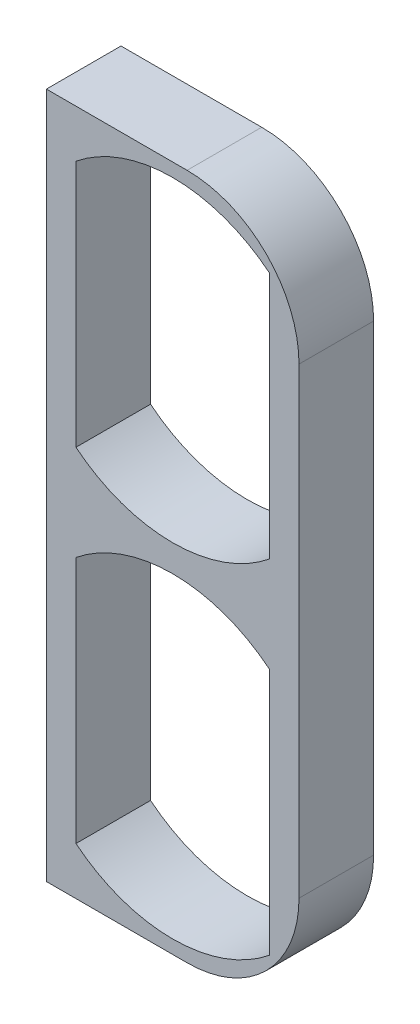
ISO-10303-21;
HEADER;
FILE_DESCRIPTION(('STEP AP214'),'2;1');
FILE_NAME('part.step','',(''),(''),'','','');
FILE_SCHEMA(('AUTOMOTIVE_DESIGN { 1 0 10303 214 1 1 1 1 }'));
ENDSEC;
DATA;
#1=APPLICATION_CONTEXT('core data for automotive mechanical design processes');
#2=APPLICATION_PROTOCOL_DEFINITION('international standard','automotive_design',2000,#1);
#3=PRODUCT_CONTEXT('',#1,'mechanical');
#4=PRODUCT('Part','Part','',(#3));
#5=PRODUCT_RELATED_PRODUCT_CATEGORY('part','',(#4));
#6=PRODUCT_DEFINITION_FORMATION('','',#4);
#7=PRODUCT_DEFINITION_CONTEXT('part definition',#1,'design');
#8=PRODUCT_DEFINITION('design','',#6,#7);
#9=PRODUCT_DEFINITION_SHAPE('','',#8);
#10=(LENGTH_UNIT() NAMED_UNIT(*) SI_UNIT(.MILLI.,.METRE.));
#11=(NAMED_UNIT(*) PLANE_ANGLE_UNIT() SI_UNIT($,.RADIAN.));
#12=(NAMED_UNIT(*) SI_UNIT($,.STERADIAN.) SOLID_ANGLE_UNIT());
#13=UNCERTAINTY_MEASURE_WITH_UNIT(LENGTH_MEASURE(1.E-05),#10,'distance_accuracy_value','');
#14=(GEOMETRIC_REPRESENTATION_CONTEXT(3) GLOBAL_UNCERTAINTY_ASSIGNED_CONTEXT((#13)) GLOBAL_UNIT_ASSIGNED_CONTEXT((#10,
#11,#12)) REPRESENTATION_CONTEXT('',''));
#15=CARTESIAN_POINT('',(0.,0.,0.));
#16=DIRECTION('',(0.,0.,1.));
#17=DIRECTION('',(1.,0.,0.));
#18=AXIS2_PLACEMENT_3D('',#15,#16,#17);
#19=CARTESIAN_POINT('',(0.,0.,12.7));
#20=DIRECTION('',(0.,0.,-1.));
#21=DIRECTION('',(-1.,0.,0.));
#22=AXIS2_PLACEMENT_3D('',#19,#20,#21);
#23=PLANE('',#22);
#24=DIRECTION('',(1.,0.,0.));
#25=VECTOR('',#24,1.);
#26=CARTESIAN_POINT('',(-23.7871,-29.21,12.7));
#27=LINE('',#26,#25);
#28=CARTESIAN_POINT('',(-21.5011,-29.21,12.7));
#29=VERTEX_POINT('',#28);
#30=CARTESIAN_POINT('',(2.4511,-29.21,12.7));
#31=VERTEX_POINT('',#30);
#32=EDGE_CURVE('E200',#29,#31,#27,.T.);
#33=ORIENTED_EDGE('',*,*,#32,.T.);
#34=CARTESIAN_POINT('',(2.4511,-10.16,12.7));
#35=DIRECTION('',(0.,0.,-1.));
#36=DIRECTION('',(-1.,0.,0.));
#37=AXIS2_PLACEMENT_3D('',#34,#35,#36);
#38=CIRCLE('',#37,19.05);
#39=CARTESIAN_POINT('',(21.5011,-10.16,12.7));
#40=VERTEX_POINT('',#39);
#41=EDGE_CURVE('E42',#31,#40,#38,.F.);
#42=ORIENTED_EDGE('',*,*,#41,.T.);
#43=DIRECTION('',(0.,-1.,0.));
#44=VECTOR('',#43,1.);
#45=CARTESIAN_POINT('',(21.5011,-29.21,12.7));
#46=LINE('',#45,#44);
#47=CARTESIAN_POINT('',(21.5011,68.58,12.7));
#48=VERTEX_POINT('',#47);
#49=EDGE_CURVE('E217',#48,#40,#46,.T.);
#50=ORIENTED_EDGE('',*,*,#49,.F.);
#51=CARTESIAN_POINT('',(2.4511,68.58,12.7));
#52=DIRECTION('',(0.,0.,-1.));
#53=DIRECTION('',(-1.,0.,0.));
#54=AXIS2_PLACEMENT_3D('',#51,#52,#53);
#55=CIRCLE('',#54,19.05);
#56=CARTESIAN_POINT('',(2.4511,87.63,12.7));
#57=VERTEX_POINT('',#56);
#58=EDGE_CURVE('E49',#48,#57,#55,.F.);
#59=ORIENTED_EDGE('',*,*,#58,.T.);
#60=DIRECTION('',(1.,0.,0.));
#61=VECTOR('',#60,1.);
#62=CARTESIAN_POINT('',(-23.7871,87.63,12.7));
#63=LINE('',#62,#61);
#64=CARTESIAN_POINT('',(-21.5011,87.63,12.7));
#65=VERTEX_POINT('',#64);
#66=EDGE_CURVE('E159',#65,#57,#63,.T.);
#67=ORIENTED_EDGE('',*,*,#66,.F.);
#68=DIRECTION('',(0.,1.,0.));
#69=VECTOR('',#68,1.);
#70=CARTESIAN_POINT('',(-21.5011,87.63,12.7));
#71=LINE('',#70,#69);
#72=EDGE_CURVE('E142',#29,#65,#71,.T.);
#73=ORIENTED_EDGE('',*,*,#72,.F.);
#74=EDGE_LOOP('',(#33,#42,#50,#59,#67,#73));
#75=FACE_BOUND('',#74,.T.);
#76=CARTESIAN_POINT('',(0.,-0.761999999999999,12.7));
#77=DIRECTION('',(0.,0.,1.));
#78=DIRECTION('',(1.,0.,0.));
#79=AXIS2_PLACEMENT_3D('',#76,#77,#78);
#80=CIRCLE('',#79,26.162);
#81=CARTESIAN_POINT('',(16.4716218614369,-21.0877451832358,12.7));
#82=VERTEX_POINT('',#81);
#83=CARTESIAN_POINT('',(-16.471621861437,-21.0877451832358,12.7));
#84=VERTEX_POINT('',#83);
#85=EDGE_CURVE('E176',#82,#84,#80,.F.);
#86=ORIENTED_EDGE('',*,*,#85,.T.);
#87=DIRECTION('',(0.,-1.,0.));
#88=VECTOR('',#87,1.);
#89=CARTESIAN_POINT('',(-16.471621861437,0.,12.7));
#90=LINE('',#89,#88);
#91=CARTESIAN_POINT('',(-16.4716218614369,21.0877451832358,12.7));
#92=VERTEX_POINT('',#91);
#93=EDGE_CURVE('E185',#92,#84,#90,.T.);
#94=ORIENTED_EDGE('',*,*,#93,.F.);
#95=CARTESIAN_POINT('',(0.,0.761999999999999,12.7));
#96=DIRECTION('',(0.,0.,1.));
#97=DIRECTION('',(1.,0.,0.));
#98=AXIS2_PLACEMENT_3D('',#95,#96,#97);
#99=CIRCLE('',#98,26.162);
#100=CARTESIAN_POINT('',(16.4716218614369,21.0877451832358,12.7));
#101=VERTEX_POINT('',#100);
#102=EDGE_CURVE('E182',#101,#92,#99,.T.);
#103=ORIENTED_EDGE('',*,*,#102,.F.);
#104=DIRECTION('',(0.,-1.,0.));
#105=VECTOR('',#104,1.);
#106=CARTESIAN_POINT('',(16.4716218614369,0.,12.7));
#107=LINE('',#106,#105);
#108=EDGE_CURVE('E179',#101,#82,#107,.T.);
#109=ORIENTED_EDGE('',*,*,#108,.T.);
#110=EDGE_LOOP('',(#86,#94,#103,#109));
#111=FACE_BOUND('',#110,.T.);
#112=CARTESIAN_POINT('',(0.,59.182,12.7));
#113=DIRECTION('',(0.,0.,-1.));
#114=DIRECTION('',(1.,0.,0.));
#115=AXIS2_PLACEMENT_3D('',#112,#113,#114);
#116=CIRCLE('',#115,26.162);
#117=CARTESIAN_POINT('',(16.4716218614369,79.5077451832358,12.7));
#118=VERTEX_POINT('',#117);
#119=CARTESIAN_POINT('',(-16.471621861437,79.5077451832358,12.7));
#120=VERTEX_POINT('',#119);
#121=EDGE_CURVE('E240',#118,#120,#116,.F.);
#122=ORIENTED_EDGE('',*,*,#121,.F.);
#123=DIRECTION('',(0.,1.,0.));
#124=VECTOR('',#123,1.);
#125=CARTESIAN_POINT('',(16.4716218614369,58.42,12.7));
#126=LINE('',#125,#124);
#127=CARTESIAN_POINT('',(16.4716218614369,37.3322548167642,12.7));
#128=VERTEX_POINT('',#127);
#129=EDGE_CURVE('E243',#128,#118,#126,.T.);
#130=ORIENTED_EDGE('',*,*,#129,.F.);
#131=CARTESIAN_POINT('',(0.,57.658,12.7));
#132=DIRECTION('',(0.,0.,-1.));
#133=DIRECTION('',(1.,0.,0.));
#134=AXIS2_PLACEMENT_3D('',#131,#132,#133);
#135=CIRCLE('',#134,26.162);
#136=CARTESIAN_POINT('',(-16.4716218614369,37.3322548167642,12.7));
#137=VERTEX_POINT('',#136);
#138=EDGE_CURVE('E246',#128,#137,#135,.T.);
#139=ORIENTED_EDGE('',*,*,#138,.T.);
#140=DIRECTION('',(0.,1.,0.));
#141=VECTOR('',#140,1.);
#142=CARTESIAN_POINT('',(-16.471621861437,58.42,12.7));
#143=LINE('',#142,#141);
#144=EDGE_CURVE('E249',#137,#120,#143,.T.);
#145=ORIENTED_EDGE('',*,*,#144,.T.);
#146=EDGE_LOOP('',(#122,#130,#139,#145));
#147=FACE_BOUND('',#146,.T.);
#148=ADVANCED_FACE('F34',(#75,#111,#147),#23,.F.);
#149=CARTESIAN_POINT('',(0.,0.,0.));
#150=DIRECTION('',(0.,0.,-1.));
#151=DIRECTION('',(-1.,0.,0.));
#152=AXIS2_PLACEMENT_3D('',#149,#150,#151);
#153=PLANE('',#152);
#154=DIRECTION('',(0.,1.,0.));
#155=VECTOR('',#154,1.);
#156=CARTESIAN_POINT('',(21.5011,-29.21,0.));
#157=LINE('',#156,#155);
#158=CARTESIAN_POINT('',(21.5011,-10.16,0.));
#159=VERTEX_POINT('',#158);
#160=CARTESIAN_POINT('',(21.5011,68.58,0.));
#161=VERTEX_POINT('',#160);
#162=EDGE_CURVE('E224',#159,#161,#157,.T.);
#163=ORIENTED_EDGE('',*,*,#162,.F.);
#164=CARTESIAN_POINT('',(2.4511,-10.16,0.));
#165=DIRECTION('',(0.,0.,-1.));
#166=DIRECTION('',(-1.,0.,0.));
#167=AXIS2_PLACEMENT_3D('',#164,#165,#166);
#168=CIRCLE('',#167,19.05);
#169=CARTESIAN_POINT('',(2.4511,-29.21,0.));
#170=VERTEX_POINT('',#169);
#171=EDGE_CURVE('E211',#159,#170,#168,.T.);
#172=ORIENTED_EDGE('',*,*,#171,.T.);
#173=DIRECTION('',(1.,0.,0.));
#174=VECTOR('',#173,1.);
#175=CARTESIAN_POINT('',(-23.7871,-29.21,0.));
#176=LINE('',#175,#174);
#177=CARTESIAN_POINT('',(-21.5011,-29.21,0.));
#178=VERTEX_POINT('',#177);
#179=EDGE_CURVE('E154',#178,#170,#176,.T.);
#180=ORIENTED_EDGE('',*,*,#179,.F.);
#181=DIRECTION('',(0.,-1.,0.));
#182=VECTOR('',#181,1.);
#183=CARTESIAN_POINT('',(-21.5011,87.63,0.));
#184=LINE('',#183,#182);
#185=CARTESIAN_POINT('',(-21.5011,87.63,0.));
#186=VERTEX_POINT('',#185);
#187=EDGE_CURVE('E139',#186,#178,#184,.T.);
#188=ORIENTED_EDGE('',*,*,#187,.F.);
#189=DIRECTION('',(1.,0.,0.));
#190=VECTOR('',#189,1.);
#191=CARTESIAN_POINT('',(-23.7871,87.63,0.));
#192=LINE('',#191,#190);
#193=CARTESIAN_POINT('',(2.4511,87.63,0.));
#194=VERTEX_POINT('',#193);
#195=EDGE_CURVE('E152',#186,#194,#192,.T.);
#196=ORIENTED_EDGE('',*,*,#195,.T.);
#197=CARTESIAN_POINT('',(2.4511,68.58,0.));
#198=DIRECTION('',(0.,0.,-1.));
#199=DIRECTION('',(-1.,0.,0.));
#200=AXIS2_PLACEMENT_3D('',#197,#198,#199);
#201=CIRCLE('',#200,19.05);
#202=EDGE_CURVE('E209',#194,#161,#201,.T.);
#203=ORIENTED_EDGE('',*,*,#202,.T.);
#204=EDGE_LOOP('',(#163,#172,#180,#188,#196,#203));
#205=FACE_BOUND('',#204,.T.);
#206=DIRECTION('',(0.,-1.,0.));
#207=VECTOR('',#206,1.);
#208=CARTESIAN_POINT('',(-16.471621861437,0.,0.));
#209=LINE('',#208,#207);
#210=CARTESIAN_POINT('',(-16.4716218614369,21.0877451832358,0.));
#211=VERTEX_POINT('',#210);
#212=CARTESIAN_POINT('',(-16.471621861437,-21.0877451832358,0.));
#213=VERTEX_POINT('',#212);
#214=EDGE_CURVE('E170',#211,#213,#209,.T.);
#215=ORIENTED_EDGE('',*,*,#214,.T.);
#216=CARTESIAN_POINT('',(0.,-0.761999999999999,0.));
#217=DIRECTION('',(0.,0.,-1.));
#218=DIRECTION('',(-1.,0.,0.));
#219=AXIS2_PLACEMENT_3D('',#216,#217,#218);
#220=CIRCLE('',#219,26.162);
#221=CARTESIAN_POINT('',(16.4716218614369,-21.0877451832358,0.));
#222=VERTEX_POINT('',#221);
#223=EDGE_CURVE('E173',#222,#213,#220,.T.);
#224=ORIENTED_EDGE('',*,*,#223,.F.);
#225=DIRECTION('',(0.,-1.,0.));
#226=VECTOR('',#225,1.);
#227=CARTESIAN_POINT('',(16.4716218614369,0.,0.));
#228=LINE('',#227,#226);
#229=CARTESIAN_POINT('',(16.4716218614369,21.0877451832358,0.));
#230=VERTEX_POINT('',#229);
#231=EDGE_CURVE('E191',#230,#222,#228,.T.);
#232=ORIENTED_EDGE('',*,*,#231,.F.);
#233=CARTESIAN_POINT('',(0.,0.761999999999999,0.));
#234=DIRECTION('',(0.,0.,-1.));
#235=DIRECTION('',(-1.,0.,0.));
#236=AXIS2_PLACEMENT_3D('',#233,#234,#235);
#237=CIRCLE('',#236,26.162);
#238=EDGE_CURVE('E162',#230,#211,#237,.F.);
#239=ORIENTED_EDGE('',*,*,#238,.T.);
#240=EDGE_LOOP('',(#215,#224,#232,#239));
#241=FACE_BOUND('',#240,.T.);
#242=DIRECTION('',(0.,1.,0.));
#243=VECTOR('',#242,1.);
#244=CARTESIAN_POINT('',(-16.471621861437,58.42,0.));
#245=LINE('',#244,#243);
#246=CARTESIAN_POINT('',(-16.4716218614369,37.3322548167642,0.));
#247=VERTEX_POINT('',#246);
#248=CARTESIAN_POINT('',(-16.471621861437,79.5077451832358,0.));
#249=VERTEX_POINT('',#248);
#250=EDGE_CURVE('E234',#247,#249,#245,.T.);
#251=ORIENTED_EDGE('',*,*,#250,.F.);
#252=CARTESIAN_POINT('',(0.,57.658,0.));
#253=DIRECTION('',(0.,0.,1.));
#254=DIRECTION('',(-1.,0.,0.));
#255=AXIS2_PLACEMENT_3D('',#252,#253,#254);
#256=CIRCLE('',#255,26.162);
#257=CARTESIAN_POINT('',(16.4716218614369,37.3322548167642,0.));
#258=VERTEX_POINT('',#257);
#259=EDGE_CURVE('E231',#258,#247,#256,.F.);
#260=ORIENTED_EDGE('',*,*,#259,.F.);
#261=DIRECTION('',(0.,1.,0.));
#262=VECTOR('',#261,1.);
#263=CARTESIAN_POINT('',(16.4716218614369,58.42,0.));
#264=LINE('',#263,#262);
#265=CARTESIAN_POINT('',(16.4716218614369,79.5077451832358,0.));
#266=VERTEX_POINT('',#265);
#267=EDGE_CURVE('E160',#258,#266,#264,.T.);
#268=ORIENTED_EDGE('',*,*,#267,.T.);
#269=CARTESIAN_POINT('',(0.,59.182,0.));
#270=DIRECTION('',(0.,0.,1.));
#271=DIRECTION('',(-1.,0.,0.));
#272=AXIS2_PLACEMENT_3D('',#269,#270,#271);
#273=CIRCLE('',#272,26.162);
#274=EDGE_CURVE('E237',#266,#249,#273,.T.);
#275=ORIENTED_EDGE('',*,*,#274,.T.);
#276=EDGE_LOOP('',(#251,#260,#268,#275));
#277=FACE_BOUND('',#276,.T.);
#278=ADVANCED_FACE('F150',(#205,#241,#277),#153,.T.);
#279=CARTESIAN_POINT('',(-23.7871,-29.21,12.7));
#280=DIRECTION('',(0.,1.,0.));
#281=DIRECTION('',(0.,0.,1.));
#282=AXIS2_PLACEMENT_3D('',#279,#280,#281);
#283=PLANE('',#282);
#284=ORIENTED_EDGE('',*,*,#179,.T.);
#285=DIRECTION('',(0.,0.,-1.));
#286=VECTOR('',#285,1.);
#287=CARTESIAN_POINT('',(2.4511,-29.21,12.7));
#288=LINE('',#287,#286);
#289=EDGE_CURVE('E57',#170,#31,#288,.F.);
#290=ORIENTED_EDGE('',*,*,#289,.T.);
#291=ORIENTED_EDGE('',*,*,#32,.F.);
#292=DIRECTION('',(0.,0.,1.));
#293=VECTOR('',#292,1.);
#294=CARTESIAN_POINT('',(-21.5011,-29.21,12.7));
#295=LINE('',#294,#293);
#296=EDGE_CURVE('E155',#178,#29,#295,.T.);
#297=ORIENTED_EDGE('',*,*,#296,.F.);
#298=EDGE_LOOP('',(#284,#290,#291,#297));
#299=FACE_BOUND('',#298,.T.);
#300=ADVANCED_FACE('F227',(#299),#283,.F.);
#301=CARTESIAN_POINT('',(0.,-0.761999999999999,-0.000999999999999265));
#302=DIRECTION('',(0.,0.,1.));
#303=DIRECTION('',(1.,0.,0.));
#304=AXIS2_PLACEMENT_3D('',#301,#302,#303);
#305=CYLINDRICAL_SURFACE('',#304,26.162);
#306=ORIENTED_EDGE('',*,*,#223,.T.);
#307=DIRECTION('',(0.,0.,1.));
#308=VECTOR('',#307,1.);
#309=CARTESIAN_POINT('',(-16.471621861437,-21.0877451832358,-0.000999999999999265));
#310=LINE('',#309,#308);
#311=EDGE_CURVE('E189',#213,#84,#310,.T.);
#312=ORIENTED_EDGE('',*,*,#311,.T.);
#313=ORIENTED_EDGE('',*,*,#85,.F.);
#314=DIRECTION('',(0.,0.,1.));
#315=VECTOR('',#314,1.);
#316=CARTESIAN_POINT('',(16.4716218614369,-21.0877451832358,-0.000999999999999265));
#317=LINE('',#316,#315);
#318=EDGE_CURVE('E188',#222,#82,#317,.T.);
#319=ORIENTED_EDGE('',*,*,#318,.F.);
#320=EDGE_LOOP('',(#306,#312,#313,#319));
#321=FACE_BOUND('',#320,.T.);
#322=ADVANCED_FACE('F291',(#321),#305,.F.);
#323=CARTESIAN_POINT('',(-16.471621861437,0.,-0.000999999999999265));
#324=DIRECTION('',(-1.,0.,0.));
#325=DIRECTION('',(0.,-1.,0.));
#326=AXIS2_PLACEMENT_3D('',#323,#324,#325);
#327=PLANE('',#326);
#328=DIRECTION('',(0.,0.,1.));
#329=VECTOR('',#328,1.);
#330=CARTESIAN_POINT('',(-16.4716218614369,21.0877451832358,-0.000999999999999265));
#331=LINE('',#330,#329);
#332=EDGE_CURVE('E192',#211,#92,#331,.T.);
#333=ORIENTED_EDGE('',*,*,#332,.T.);
#334=ORIENTED_EDGE('',*,*,#93,.T.);
#335=ORIENTED_EDGE('',*,*,#311,.F.);
#336=ORIENTED_EDGE('',*,*,#214,.F.);
#337=EDGE_LOOP('',(#333,#334,#335,#336));
#338=FACE_BOUND('',#337,.T.);
#339=ADVANCED_FACE('F389',(#338),#327,.F.);
#340=CARTESIAN_POINT('',(0.,0.761999999999999,-0.000999999999999265));
#341=DIRECTION('',(0.,0.,1.));
#342=DIRECTION('',(1.,0.,0.));
#343=AXIS2_PLACEMENT_3D('',#340,#341,#342);
#344=CYLINDRICAL_SURFACE('',#343,26.162);
#345=DIRECTION('',(0.,0.,1.));
#346=VECTOR('',#345,1.);
#347=CARTESIAN_POINT('',(16.4716218614369,21.0877451832358,-0.000999999999999265));
#348=LINE('',#347,#346);
#349=EDGE_CURVE('E194',#230,#101,#348,.T.);
#350=ORIENTED_EDGE('',*,*,#349,.T.);
#351=ORIENTED_EDGE('',*,*,#102,.T.);
#352=ORIENTED_EDGE('',*,*,#332,.F.);
#353=ORIENTED_EDGE('',*,*,#238,.F.);
#354=EDGE_LOOP('',(#350,#351,#352,#353));
#355=FACE_BOUND('',#354,.T.);
#356=ADVANCED_FACE('F381',(#355),#344,.F.);
#357=CARTESIAN_POINT('',(16.4716218614369,0.,-0.000999999999999265));
#358=DIRECTION('',(-1.,0.,0.));
#359=DIRECTION('',(0.,-1.,0.));
#360=AXIS2_PLACEMENT_3D('',#357,#358,#359);
#361=PLANE('',#360);
#362=ORIENTED_EDGE('',*,*,#231,.T.);
#363=ORIENTED_EDGE('',*,*,#318,.T.);
#364=ORIENTED_EDGE('',*,*,#108,.F.);
#365=ORIENTED_EDGE('',*,*,#349,.F.);
#366=EDGE_LOOP('',(#362,#363,#364,#365));
#367=FACE_BOUND('',#366,.T.);
#368=ADVANCED_FACE('F349',(#367),#361,.T.);
#369=CARTESIAN_POINT('',(-23.7871,87.63,12.7));
#370=DIRECTION('',(0.,-1.,0.));
#371=DIRECTION('',(0.,0.,1.));
#372=AXIS2_PLACEMENT_3D('',#369,#370,#371);
#373=PLANE('',#372);
#374=ORIENTED_EDGE('',*,*,#66,.T.);
#375=DIRECTION('',(0.,0.,1.));
#376=VECTOR('',#375,1.);
#377=CARTESIAN_POINT('',(2.4511,87.63,12.7));
#378=LINE('',#377,#376);
#379=EDGE_CURVE('E11',#57,#194,#378,.F.);
#380=ORIENTED_EDGE('',*,*,#379,.T.);
#381=ORIENTED_EDGE('',*,*,#195,.F.);
#382=DIRECTION('',(0.,0.,-1.));
#383=VECTOR('',#382,1.);
#384=CARTESIAN_POINT('',(-21.5011,87.63,12.7));
#385=LINE('',#384,#383);
#386=EDGE_CURVE('E136',#65,#186,#385,.T.);
#387=ORIENTED_EDGE('',*,*,#386,.F.);
#388=EDGE_LOOP('',(#374,#380,#381,#387));
#389=FACE_BOUND('',#388,.T.);
#390=ADVANCED_FACE('F157',(#389),#373,.F.);
#391=CARTESIAN_POINT('',(0.,59.182,-0.000999999999999265));
#392=DIRECTION('',(0.,0.,1.));
#393=DIRECTION('',(1.,0.,0.));
#394=AXIS2_PLACEMENT_3D('',#391,#392,#393);
#395=CYLINDRICAL_SURFACE('',#394,26.162);
#396=ORIENTED_EDGE('',*,*,#274,.F.);
#397=DIRECTION('',(0.,0.,1.));
#398=VECTOR('',#397,1.);
#399=CARTESIAN_POINT('',(16.4716218614369,79.5077451832358,-0.000999999999999265));
#400=LINE('',#399,#398);
#401=EDGE_CURVE('E252',#266,#118,#400,.T.);
#402=ORIENTED_EDGE('',*,*,#401,.T.);
#403=ORIENTED_EDGE('',*,*,#121,.T.);
#404=DIRECTION('',(0.,0.,1.));
#405=VECTOR('',#404,1.);
#406=CARTESIAN_POINT('',(-16.471621861437,79.5077451832358,-0.000999999999999265));
#407=LINE('',#406,#405);
#408=EDGE_CURVE('E165',#249,#120,#407,.T.);
#409=ORIENTED_EDGE('',*,*,#408,.F.);
#410=EDGE_LOOP('',(#396,#402,#403,#409));
#411=FACE_BOUND('',#410,.T.);
#412=ADVANCED_FACE('F260',(#411),#395,.F.);
#413=CARTESIAN_POINT('',(-16.471621861437,58.42,-0.000999999999999265));
#414=DIRECTION('',(-1.,0.,0.));
#415=DIRECTION('',(0.,1.,0.));
#416=AXIS2_PLACEMENT_3D('',#413,#414,#415);
#417=PLANE('',#416);
#418=DIRECTION('',(0.,0.,1.));
#419=VECTOR('',#418,1.);
#420=CARTESIAN_POINT('',(-16.4716218614369,37.3322548167642,-0.000999999999999265));
#421=LINE('',#420,#419);
#422=EDGE_CURVE('E254',#247,#137,#421,.T.);
#423=ORIENTED_EDGE('',*,*,#422,.F.);
#424=ORIENTED_EDGE('',*,*,#250,.T.);
#425=ORIENTED_EDGE('',*,*,#408,.T.);
#426=ORIENTED_EDGE('',*,*,#144,.F.);
#427=EDGE_LOOP('',(#423,#424,#425,#426));
#428=FACE_BOUND('',#427,.T.);
#429=ADVANCED_FACE('F270',(#428),#417,.F.);
#430=CARTESIAN_POINT('',(0.,57.658,-0.000999999999999265));
#431=DIRECTION('',(0.,0.,1.));
#432=DIRECTION('',(1.,0.,0.));
#433=AXIS2_PLACEMENT_3D('',#430,#431,#432);
#434=CYLINDRICAL_SURFACE('',#433,26.162);
#435=DIRECTION('',(0.,0.,1.));
#436=VECTOR('',#435,1.);
#437=CARTESIAN_POINT('',(16.4716218614369,37.3322548167642,-0.000999999999999265));
#438=LINE('',#437,#436);
#439=EDGE_CURVE('E256',#258,#128,#438,.T.);
#440=ORIENTED_EDGE('',*,*,#439,.F.);
#441=ORIENTED_EDGE('',*,*,#259,.T.);
#442=ORIENTED_EDGE('',*,*,#422,.T.);
#443=ORIENTED_EDGE('',*,*,#138,.F.);
#444=EDGE_LOOP('',(#440,#441,#442,#443));
#445=FACE_BOUND('',#444,.T.);
#446=ADVANCED_FACE('F275',(#445),#434,.F.);
#447=CARTESIAN_POINT('',(16.4716218614369,58.42,-0.000999999999999265));
#448=DIRECTION('',(-1.,0.,0.));
#449=DIRECTION('',(0.,1.,0.));
#450=AXIS2_PLACEMENT_3D('',#447,#448,#449);
#451=PLANE('',#450);
#452=ORIENTED_EDGE('',*,*,#267,.F.);
#453=ORIENTED_EDGE('',*,*,#439,.T.);
#454=ORIENTED_EDGE('',*,*,#129,.T.);
#455=ORIENTED_EDGE('',*,*,#401,.F.);
#456=EDGE_LOOP('',(#452,#453,#454,#455));
#457=FACE_BOUND('',#456,.T.);
#458=ADVANCED_FACE('F265',(#457),#451,.T.);
#459=CARTESIAN_POINT('',(21.5011,0.,0.));
#460=DIRECTION('',(-1.,0.,0.));
#461=DIRECTION('',(0.,0.,1.));
#462=AXIS2_PLACEMENT_3D('',#459,#460,#461);
#463=PLANE('',#462);
#464=ORIENTED_EDGE('',*,*,#49,.T.);
#465=DIRECTION('',(0.,0.,-1.));
#466=VECTOR('',#465,1.);
#467=CARTESIAN_POINT('',(21.5011,-10.16,0.));
#468=LINE('',#467,#466);
#469=EDGE_CURVE('E206',#40,#159,#468,.T.);
#470=ORIENTED_EDGE('',*,*,#469,.T.);
#471=ORIENTED_EDGE('',*,*,#162,.T.);
#472=DIRECTION('',(0.,0.,1.));
#473=VECTOR('',#472,1.);
#474=CARTESIAN_POINT('',(21.5011,68.58,0.));
#475=LINE('',#474,#473);
#476=EDGE_CURVE('E202',#161,#48,#475,.T.);
#477=ORIENTED_EDGE('',*,*,#476,.T.);
#478=EDGE_LOOP('',(#464,#470,#471,#477));
#479=FACE_BOUND('',#478,.T.);
#480=ADVANCED_FACE('F221',(#479),#463,.F.);
#481=CARTESIAN_POINT('',(-21.5011,0.,0.));
#482=DIRECTION('',(1.,0.,0.));
#483=DIRECTION('',(0.,0.,-1.));
#484=AXIS2_PLACEMENT_3D('',#481,#482,#483);
#485=PLANE('',#484);
#486=ORIENTED_EDGE('',*,*,#72,.T.);
#487=ORIENTED_EDGE('',*,*,#386,.T.);
#488=ORIENTED_EDGE('',*,*,#187,.T.);
#489=ORIENTED_EDGE('',*,*,#296,.T.);
#490=EDGE_LOOP('',(#486,#487,#488,#489));
#491=FACE_BOUND('',#490,.T.);
#492=ADVANCED_FACE('F138',(#491),#485,.F.);
#493=CARTESIAN_POINT('',(2.4511,-10.16,0.));
#494=DIRECTION('',(0.,0.,-1.));
#495=DIRECTION('',(-1.,0.,0.));
#496=AXIS2_PLACEMENT_3D('',#493,#494,#495);
#497=CYLINDRICAL_SURFACE('',#496,19.05);
#498=ORIENTED_EDGE('',*,*,#41,.F.);
#499=ORIENTED_EDGE('',*,*,#289,.F.);
#500=ORIENTED_EDGE('',*,*,#171,.F.);
#501=ORIENTED_EDGE('',*,*,#469,.F.);
#502=EDGE_LOOP('',(#498,#499,#500,#501));
#503=FACE_BOUND('',#502,.T.);
#504=ADVANCED_FACE('F226',(#503),#497,.T.);
#505=CARTESIAN_POINT('',(2.4511,68.58,0.));
#506=DIRECTION('',(0.,0.,1.));
#507=DIRECTION('',(1.,0.,0.));
#508=AXIS2_PLACEMENT_3D('',#505,#506,#507);
#509=CYLINDRICAL_SURFACE('',#508,19.05);
#510=ORIENTED_EDGE('',*,*,#202,.F.);
#511=ORIENTED_EDGE('',*,*,#379,.F.);
#512=ORIENTED_EDGE('',*,*,#58,.F.);
#513=ORIENTED_EDGE('',*,*,#476,.F.);
#514=EDGE_LOOP('',(#510,#511,#512,#513));
#515=FACE_BOUND('',#514,.T.);
#516=ADVANCED_FACE('F36',(#515),#509,.T.);
#517=CLOSED_SHELL('',(#148,#278,#300,#322,#339,#356,#368,#390,#412,#429,#446,#458,#480,#492,
#504,#516));
#518=MANIFOLD_SOLID_BREP('B2',#517);
#519=ADVANCED_BREP_SHAPE_REPRESENTATION('',(#18,#518),#14);
#520=SHAPE_DEFINITION_REPRESENTATION(#9,#519);
ENDSEC;
END-ISO-10303-21;
